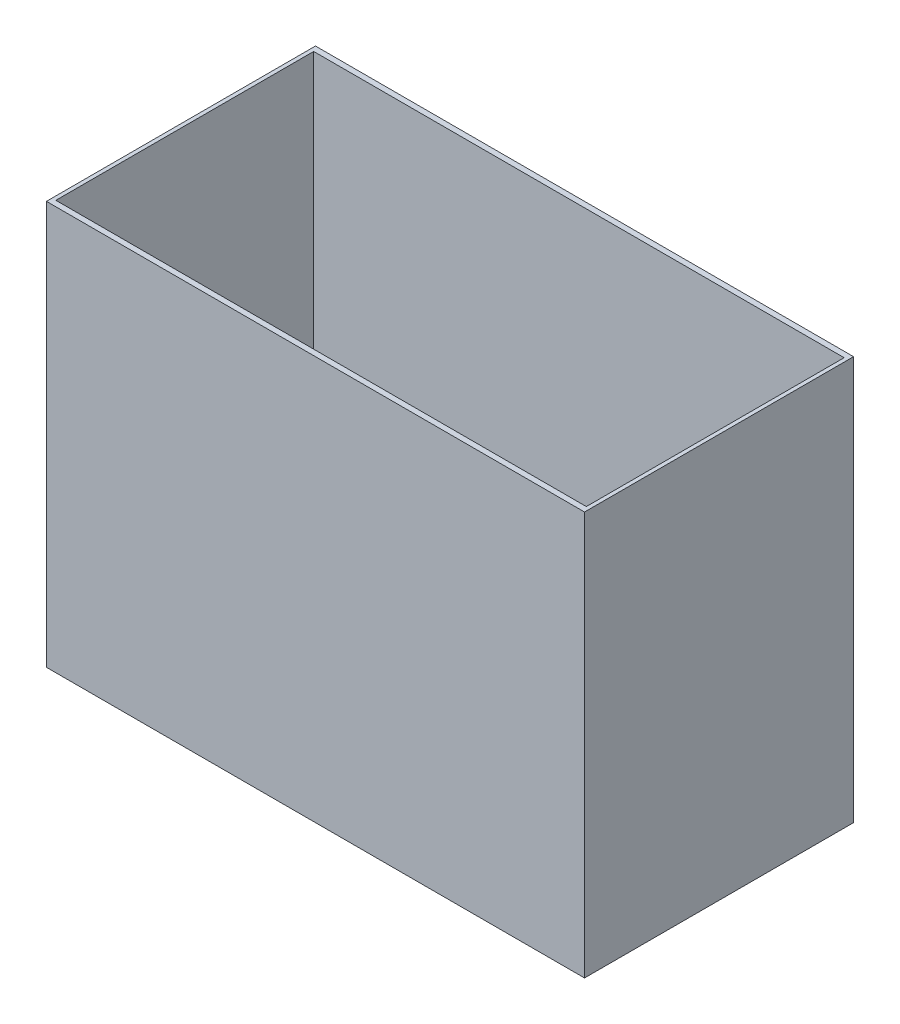
ISO-10303-21;
HEADER;
FILE_DESCRIPTION(('STEP AP214'),'2;1');
FILE_NAME('part.step','',(''),(''),'','','');
FILE_SCHEMA(('AUTOMOTIVE_DESIGN { 1 0 10303 214 1 1 1 1 }'));
ENDSEC;
DATA;
#1=APPLICATION_CONTEXT('core data for automotive mechanical design processes');
#2=APPLICATION_PROTOCOL_DEFINITION('international standard','automotive_design',2000,#1);
#3=PRODUCT_CONTEXT('',#1,'mechanical');
#4=PRODUCT('Part','Part','',(#3));
#5=PRODUCT_RELATED_PRODUCT_CATEGORY('part','',(#4));
#6=PRODUCT_DEFINITION_FORMATION('','',#4);
#7=PRODUCT_DEFINITION_CONTEXT('part definition',#1,'design');
#8=PRODUCT_DEFINITION('design','',#6,#7);
#9=PRODUCT_DEFINITION_SHAPE('','',#8);
#10=(LENGTH_UNIT() NAMED_UNIT(*) SI_UNIT(.MILLI.,.METRE.));
#11=(NAMED_UNIT(*) PLANE_ANGLE_UNIT() SI_UNIT($,.RADIAN.));
#12=(NAMED_UNIT(*) SI_UNIT($,.STERADIAN.) SOLID_ANGLE_UNIT());
#13=UNCERTAINTY_MEASURE_WITH_UNIT(LENGTH_MEASURE(1.E-05),#10,'distance_accuracy_value','');
#14=(GEOMETRIC_REPRESENTATION_CONTEXT(3) GLOBAL_UNCERTAINTY_ASSIGNED_CONTEXT((#13)) GLOBAL_UNIT_ASSIGNED_CONTEXT((#10,
#11,#12)) REPRESENTATION_CONTEXT('',''));
#15=CARTESIAN_POINT('',(0.,0.,0.));
#16=DIRECTION('',(0.,0.,1.));
#17=DIRECTION('',(1.,0.,0.));
#18=AXIS2_PLACEMENT_3D('',#15,#16,#17);
#19=CARTESIAN_POINT('',(0.,457.2,0.));
#20=DIRECTION('',(0.,-1.,0.));
#21=DIRECTION('',(0.,0.,-1.));
#22=AXIS2_PLACEMENT_3D('',#19,#20,#21);
#23=PLANE('',#22);
#24=DIRECTION('',(0.,0.,-1.));
#25=VECTOR('',#24,1.);
#26=CARTESIAN_POINT('',(304.8,457.2,152.4));
#27=LINE('',#26,#25);
#28=CARTESIAN_POINT('',(304.8,457.2,152.4));
#29=VERTEX_POINT('',#28);
#30=CARTESIAN_POINT('',(304.8,457.2,-152.4));
#31=VERTEX_POINT('',#30);
#32=EDGE_CURVE('E151',#29,#31,#27,.T.);
#33=ORIENTED_EDGE('',*,*,#32,.T.);
#34=DIRECTION('',(-1.,0.,0.));
#35=VECTOR('',#34,1.);
#36=CARTESIAN_POINT('',(-304.8,457.2,-152.4));
#37=LINE('',#36,#35);
#38=CARTESIAN_POINT('',(-304.8,457.2,-152.4));
#39=VERTEX_POINT('',#38);
#40=EDGE_CURVE('E154',#31,#39,#37,.T.);
#41=ORIENTED_EDGE('',*,*,#40,.T.);
#42=DIRECTION('',(0.,0.,1.));
#43=VECTOR('',#42,1.);
#44=CARTESIAN_POINT('',(-304.8,457.2,152.4));
#45=LINE('',#44,#43);
#46=CARTESIAN_POINT('',(-304.8,457.2,152.4));
#47=VERTEX_POINT('',#46);
#48=EDGE_CURVE('E157',#39,#47,#45,.T.);
#49=ORIENTED_EDGE('',*,*,#48,.T.);
#50=DIRECTION('',(1.,0.,0.));
#51=VECTOR('',#50,1.);
#52=CARTESIAN_POINT('',(-304.8,457.2,152.4));
#53=LINE('',#52,#51);
#54=EDGE_CURVE('E159',#47,#29,#53,.T.);
#55=ORIENTED_EDGE('',*,*,#54,.T.);
#56=EDGE_LOOP('',(#33,#41,#49,#55));
#57=FACE_BOUND('',#56,.T.);
#58=DIRECTION('',(0.,0.,-1.));
#59=VECTOR('',#58,1.);
#60=CARTESIAN_POINT('',(300.482,457.2,146.05));
#61=LINE('',#60,#59);
#62=CARTESIAN_POINT('',(300.482,457.2,146.05));
#63=VERTEX_POINT('',#62);
#64=CARTESIAN_POINT('',(300.482,457.2,-146.05));
#65=VERTEX_POINT('',#64);
#66=EDGE_CURVE('E115',#63,#65,#61,.T.);
#67=ORIENTED_EDGE('',*,*,#66,.F.);
#68=DIRECTION('',(1.,0.,0.));
#69=VECTOR('',#68,1.);
#70=CARTESIAN_POINT('',(-300.482,457.2,146.05));
#71=LINE('',#70,#69);
#72=CARTESIAN_POINT('',(-300.482,457.2,146.05));
#73=VERTEX_POINT('',#72);
#74=EDGE_CURVE('E137',#73,#63,#71,.T.);
#75=ORIENTED_EDGE('',*,*,#74,.F.);
#76=DIRECTION('',(0.,0.,1.));
#77=VECTOR('',#76,1.);
#78=CARTESIAN_POINT('',(-300.482,457.2,146.05));
#79=LINE('',#78,#77);
#80=CARTESIAN_POINT('',(-300.482,457.2,-146.05));
#81=VERTEX_POINT('',#80);
#82=EDGE_CURVE('E135',#81,#73,#79,.T.);
#83=ORIENTED_EDGE('',*,*,#82,.F.);
#84=DIRECTION('',(-1.,0.,0.));
#85=VECTOR('',#84,1.);
#86=CARTESIAN_POINT('',(-300.482,457.2,-146.05));
#87=LINE('',#86,#85);
#88=EDGE_CURVE('E123',#65,#81,#87,.T.);
#89=ORIENTED_EDGE('',*,*,#88,.F.);
#90=EDGE_LOOP('',(#67,#75,#83,#89));
#91=FACE_BOUND('',#90,.T.);
#92=ADVANCED_FACE('F50',(#57,#91),#23,.F.);
#93=CARTESIAN_POINT('',(0.,0.,0.));
#94=DIRECTION('',(0.,-1.,0.));
#95=DIRECTION('',(0.,0.,-1.));
#96=AXIS2_PLACEMENT_3D('',#93,#94,#95);
#97=PLANE('',#96);
#98=DIRECTION('',(0.,0.,-1.));
#99=VECTOR('',#98,1.);
#100=CARTESIAN_POINT('',(304.8,0.,152.4));
#101=LINE('',#100,#99);
#102=CARTESIAN_POINT('',(304.8,0.,152.4));
#103=VERTEX_POINT('',#102);
#104=CARTESIAN_POINT('',(304.8,0.,-152.4));
#105=VERTEX_POINT('',#104);
#106=EDGE_CURVE('E131',#103,#105,#101,.T.);
#107=ORIENTED_EDGE('',*,*,#106,.F.);
#108=DIRECTION('',(1.,0.,0.));
#109=VECTOR('',#108,1.);
#110=CARTESIAN_POINT('',(-304.8,0.,152.4));
#111=LINE('',#110,#109);
#112=CARTESIAN_POINT('',(-304.8,0.,152.4));
#113=VERTEX_POINT('',#112);
#114=EDGE_CURVE('E155',#113,#103,#111,.T.);
#115=ORIENTED_EDGE('',*,*,#114,.F.);
#116=DIRECTION('',(0.,0.,1.));
#117=VECTOR('',#116,1.);
#118=CARTESIAN_POINT('',(-304.8,0.,152.4));
#119=LINE('',#118,#117);
#120=CARTESIAN_POINT('',(-304.8,0.,-152.4));
#121=VERTEX_POINT('',#120);
#122=EDGE_CURVE('E166',#121,#113,#119,.T.);
#123=ORIENTED_EDGE('',*,*,#122,.F.);
#124=DIRECTION('',(-1.,0.,0.));
#125=VECTOR('',#124,1.);
#126=CARTESIAN_POINT('',(-304.8,0.,-152.4));
#127=LINE('',#126,#125);
#128=EDGE_CURVE('E164',#105,#121,#127,.T.);
#129=ORIENTED_EDGE('',*,*,#128,.F.);
#130=EDGE_LOOP('',(#107,#115,#123,#129));
#131=FACE_BOUND('',#130,.T.);
#132=DIRECTION('',(1.,0.,0.));
#133=VECTOR('',#132,1.);
#134=CARTESIAN_POINT('',(-300.482,0.,146.05));
#135=LINE('',#134,#133);
#136=CARTESIAN_POINT('',(-300.482,0.,146.05));
#137=VERTEX_POINT('',#136);
#138=CARTESIAN_POINT('',(300.482,0.,146.05));
#139=VERTEX_POINT('',#138);
#140=EDGE_CURVE('E124',#137,#139,#135,.T.);
#141=ORIENTED_EDGE('',*,*,#140,.T.);
#142=DIRECTION('',(0.,0.,-1.));
#143=VECTOR('',#142,1.);
#144=CARTESIAN_POINT('',(300.482,0.,146.05));
#145=LINE('',#144,#143);
#146=CARTESIAN_POINT('',(300.482,0.,-146.05));
#147=VERTEX_POINT('',#146);
#148=EDGE_CURVE('E73',#139,#147,#145,.T.);
#149=ORIENTED_EDGE('',*,*,#148,.T.);
#150=DIRECTION('',(-1.,0.,0.));
#151=VECTOR('',#150,1.);
#152=CARTESIAN_POINT('',(-300.482,0.,-146.05));
#153=LINE('',#152,#151);
#154=CARTESIAN_POINT('',(-300.482,0.,-146.05));
#155=VERTEX_POINT('',#154);
#156=EDGE_CURVE('E130',#147,#155,#153,.T.);
#157=ORIENTED_EDGE('',*,*,#156,.T.);
#158=DIRECTION('',(0.,0.,1.));
#159=VECTOR('',#158,1.);
#160=CARTESIAN_POINT('',(-300.482,0.,146.05));
#161=LINE('',#160,#159);
#162=EDGE_CURVE('E143',#155,#137,#161,.T.);
#163=ORIENTED_EDGE('',*,*,#162,.T.);
#164=EDGE_LOOP('',(#141,#149,#157,#163));
#165=FACE_BOUND('',#164,.T.);
#166=ADVANCED_FACE('F184',(#131,#165),#97,.T.);
#167=CARTESIAN_POINT('',(304.8,457.2,152.4));
#168=DIRECTION('',(-1.,0.,0.));
#169=DIRECTION('',(0.,0.,1.));
#170=AXIS2_PLACEMENT_3D('',#167,#168,#169);
#171=PLANE('',#170);
#172=ORIENTED_EDGE('',*,*,#106,.T.);
#173=DIRECTION('',(0.,-1.,0.));
#174=VECTOR('',#173,1.);
#175=CARTESIAN_POINT('',(304.8,457.2,-152.4));
#176=LINE('',#175,#174);
#177=EDGE_CURVE('E12',#31,#105,#176,.T.);
#178=ORIENTED_EDGE('',*,*,#177,.F.);
#179=ORIENTED_EDGE('',*,*,#32,.F.);
#180=DIRECTION('',(0.,-1.,0.));
#181=VECTOR('',#180,1.);
#182=CARTESIAN_POINT('',(304.8,457.2,152.4));
#183=LINE('',#182,#181);
#184=EDGE_CURVE('E161',#29,#103,#183,.T.);
#185=ORIENTED_EDGE('',*,*,#184,.T.);
#186=EDGE_LOOP('',(#172,#178,#179,#185));
#187=FACE_BOUND('',#186,.T.);
#188=ADVANCED_FACE('F52',(#187),#171,.F.);
#189=CARTESIAN_POINT('',(-304.8,457.2,-152.4));
#190=DIRECTION('',(0.,0.,1.));
#191=DIRECTION('',(1.,0.,0.));
#192=AXIS2_PLACEMENT_3D('',#189,#190,#191);
#193=PLANE('',#192);
#194=ORIENTED_EDGE('',*,*,#128,.T.);
#195=DIRECTION('',(0.,-1.,0.));
#196=VECTOR('',#195,1.);
#197=CARTESIAN_POINT('',(-304.8,457.2,-152.4));
#198=LINE('',#197,#196);
#199=EDGE_CURVE('E58',#39,#121,#198,.T.);
#200=ORIENTED_EDGE('',*,*,#199,.F.);
#201=ORIENTED_EDGE('',*,*,#40,.F.);
#202=ORIENTED_EDGE('',*,*,#177,.T.);
#203=EDGE_LOOP('',(#194,#200,#201,#202));
#204=FACE_BOUND('',#203,.T.);
#205=ADVANCED_FACE('F194',(#204),#193,.F.);
#206=CARTESIAN_POINT('',(-304.8,457.2,152.4));
#207=DIRECTION('',(1.,0.,0.));
#208=DIRECTION('',(0.,0.,-1.));
#209=AXIS2_PLACEMENT_3D('',#206,#207,#208);
#210=PLANE('',#209);
#211=ORIENTED_EDGE('',*,*,#122,.T.);
#212=DIRECTION('',(0.,-1.,0.));
#213=VECTOR('',#212,1.);
#214=CARTESIAN_POINT('',(-304.8,457.2,152.4));
#215=LINE('',#214,#213);
#216=EDGE_CURVE('E171',#47,#113,#215,.T.);
#217=ORIENTED_EDGE('',*,*,#216,.F.);
#218=ORIENTED_EDGE('',*,*,#48,.F.);
#219=ORIENTED_EDGE('',*,*,#199,.T.);
#220=EDGE_LOOP('',(#211,#217,#218,#219));
#221=FACE_BOUND('',#220,.T.);
#222=ADVANCED_FACE('F178',(#221),#210,.F.);
#223=CARTESIAN_POINT('',(-304.8,457.2,152.4));
#224=DIRECTION('',(0.,0.,-1.));
#225=DIRECTION('',(-1.,0.,0.));
#226=AXIS2_PLACEMENT_3D('',#223,#224,#225);
#227=PLANE('',#226);
#228=ORIENTED_EDGE('',*,*,#114,.T.);
#229=ORIENTED_EDGE('',*,*,#184,.F.);
#230=ORIENTED_EDGE('',*,*,#54,.F.);
#231=ORIENTED_EDGE('',*,*,#216,.T.);
#232=EDGE_LOOP('',(#228,#229,#230,#231));
#233=FACE_BOUND('',#232,.T.);
#234=ADVANCED_FACE('F188',(#233),#227,.F.);
#235=CARTESIAN_POINT('',(300.482,457.2,146.05));
#236=DIRECTION('',(-1.,0.,0.));
#237=DIRECTION('',(0.,0.,1.));
#238=AXIS2_PLACEMENT_3D('',#235,#236,#237);
#239=PLANE('',#238);
#240=ORIENTED_EDGE('',*,*,#148,.F.);
#241=DIRECTION('',(0.,-1.,0.));
#242=VECTOR('',#241,1.);
#243=CARTESIAN_POINT('',(300.482,457.2,146.05));
#244=LINE('',#243,#242);
#245=EDGE_CURVE('E119',#63,#139,#244,.T.);
#246=ORIENTED_EDGE('',*,*,#245,.F.);
#247=ORIENTED_EDGE('',*,*,#66,.T.);
#248=DIRECTION('',(0.,-1.,0.));
#249=VECTOR('',#248,1.);
#250=CARTESIAN_POINT('',(300.482,457.2,-146.05));
#251=LINE('',#250,#249);
#252=EDGE_CURVE('E118',#65,#147,#251,.T.);
#253=ORIENTED_EDGE('',*,*,#252,.T.);
#254=EDGE_LOOP('',(#240,#246,#247,#253));
#255=FACE_BOUND('',#254,.T.);
#256=ADVANCED_FACE('F117',(#255),#239,.T.);
#257=CARTESIAN_POINT('',(-300.482,457.2,-146.05));
#258=DIRECTION('',(0.,0.,1.));
#259=DIRECTION('',(1.,0.,0.));
#260=AXIS2_PLACEMENT_3D('',#257,#258,#259);
#261=PLANE('',#260);
#262=ORIENTED_EDGE('',*,*,#156,.F.);
#263=ORIENTED_EDGE('',*,*,#252,.F.);
#264=ORIENTED_EDGE('',*,*,#88,.T.);
#265=DIRECTION('',(0.,-1.,0.));
#266=VECTOR('',#265,1.);
#267=CARTESIAN_POINT('',(-300.482,457.2,-146.05));
#268=LINE('',#267,#266);
#269=EDGE_CURVE('E132',#81,#155,#268,.T.);
#270=ORIENTED_EDGE('',*,*,#269,.T.);
#271=EDGE_LOOP('',(#262,#263,#264,#270));
#272=FACE_BOUND('',#271,.T.);
#273=ADVANCED_FACE('F127',(#272),#261,.T.);
#274=CARTESIAN_POINT('',(-300.482,457.2,146.05));
#275=DIRECTION('',(1.,0.,0.));
#276=DIRECTION('',(0.,0.,-1.));
#277=AXIS2_PLACEMENT_3D('',#274,#275,#276);
#278=PLANE('',#277);
#279=ORIENTED_EDGE('',*,*,#162,.F.);
#280=ORIENTED_EDGE('',*,*,#269,.F.);
#281=ORIENTED_EDGE('',*,*,#82,.T.);
#282=DIRECTION('',(0.,-1.,0.));
#283=VECTOR('',#282,1.);
#284=CARTESIAN_POINT('',(-300.482,457.2,146.05));
#285=LINE('',#284,#283);
#286=EDGE_CURVE('E65',#73,#137,#285,.T.);
#287=ORIENTED_EDGE('',*,*,#286,.T.);
#288=EDGE_LOOP('',(#279,#280,#281,#287));
#289=FACE_BOUND('',#288,.T.);
#290=ADVANCED_FACE('F217',(#289),#278,.T.);
#291=CARTESIAN_POINT('',(-300.482,457.2,146.05));
#292=DIRECTION('',(0.,0.,-1.));
#293=DIRECTION('',(-1.,0.,0.));
#294=AXIS2_PLACEMENT_3D('',#291,#292,#293);
#295=PLANE('',#294);
#296=ORIENTED_EDGE('',*,*,#140,.F.);
#297=ORIENTED_EDGE('',*,*,#286,.F.);
#298=ORIENTED_EDGE('',*,*,#74,.T.);
#299=ORIENTED_EDGE('',*,*,#245,.T.);
#300=EDGE_LOOP('',(#296,#297,#298,#299));
#301=FACE_BOUND('',#300,.T.);
#302=ADVANCED_FACE('F221',(#301),#295,.T.);
#303=CLOSED_SHELL('',(#92,#166,#188,#205,#222,#234,#256,#273,#290,#302));
#304=MANIFOLD_SOLID_BREP('B2_NOT_SHOWN',#303);
#305=CARTESIAN_POINT('',(254.,0.,101.6));
#306=DIRECTION('',(0.,1.,0.));
#307=DIRECTION('',(0.,0.,1.));
#308=AXIS2_PLACEMENT_3D('',#305,#306,#307);
#309=CYLINDRICAL_SURFACE('',#308,2.77812500000002);
#310=CARTESIAN_POINT('',(254.,12.7,101.6));
#311=DIRECTION('',(0.,-1.,0.));
#312=DIRECTION('',(0.,0.,-1.));
#313=AXIS2_PLACEMENT_3D('',#310,#311,#312);
#314=CIRCLE('',#313,2.77812500000002);
#315=CARTESIAN_POINT('',(254.,12.7,98.821875));
#316=VERTEX_POINT('',#315);
#317=EDGE_CURVE('E368',#316,#316,#314,.T.);
#318=ORIENTED_EDGE('',*,*,#317,.F.);
#319=EDGE_LOOP('',(#318));
#320=FACE_BOUND('',#319,.T.);
#321=CARTESIAN_POINT('',(254.,2.54,101.6));
#322=DIRECTION('',(0.,-1.,0.));
#323=DIRECTION('',(0.,0.,-1.));
#324=AXIS2_PLACEMENT_3D('',#321,#322,#323);
#325=CIRCLE('',#324,2.77812500000002);
#326=CARTESIAN_POINT('',(254.,2.54,98.821875));
#327=VERTEX_POINT('',#326);
#328=EDGE_CURVE('E284',#327,#327,#325,.T.);
#329=ORIENTED_EDGE('',*,*,#328,.T.);
#330=EDGE_LOOP('',(#329));
#331=FACE_BOUND('',#330,.T.);
#332=ADVANCED_FACE('F280',(#320,#331),#309,.F.);
#333=CARTESIAN_POINT('',(254.,0.,-101.6));
#334=DIRECTION('',(0.,1.,0.));
#335=DIRECTION('',(0.,0.,1.));
#336=AXIS2_PLACEMENT_3D('',#333,#334,#335);
#337=CYLINDRICAL_SURFACE('',#336,2.77812500000002);
#338=CARTESIAN_POINT('',(254.,12.7,-101.6));
#339=DIRECTION('',(0.,1.,0.));
#340=DIRECTION('',(0.,0.,1.));
#341=AXIS2_PLACEMENT_3D('',#338,#339,#340);
#342=CIRCLE('',#341,2.77812500000002);
#343=CARTESIAN_POINT('',(254.,12.7,-98.821875));
#344=VERTEX_POINT('',#343);
#345=EDGE_CURVE('E350',#344,#344,#342,.T.);
#346=ORIENTED_EDGE('',*,*,#345,.T.);
#347=EDGE_LOOP('',(#346));
#348=FACE_BOUND('',#347,.T.);
#349=CARTESIAN_POINT('',(254.,2.54,-101.6));
#350=DIRECTION('',(0.,-1.,0.));
#351=DIRECTION('',(0.,0.,-1.));
#352=AXIS2_PLACEMENT_3D('',#349,#350,#351);
#353=CIRCLE('',#352,2.77812500000002);
#354=CARTESIAN_POINT('',(254.,2.54,-104.378125));
#355=VERTEX_POINT('',#354);
#356=EDGE_CURVE('E355',#355,#355,#353,.F.);
#357=ORIENTED_EDGE('',*,*,#356,.F.);
#358=EDGE_LOOP('',(#357));
#359=FACE_BOUND('',#358,.T.);
#360=ADVANCED_FACE('F404',(#348,#359),#337,.F.);
#361=CARTESIAN_POINT('',(-292.1,12.7,-139.7));
#362=DIRECTION('',(1.,0.,0.));
#363=DIRECTION('',(0.,0.,-1.));
#364=AXIS2_PLACEMENT_3D('',#361,#362,#363);
#365=PLANE('',#364);
#366=DIRECTION('',(0.,0.,1.));
#367=VECTOR('',#366,1.);
#368=CARTESIAN_POINT('',(-292.1,0.,-139.7));
#369=LINE('',#368,#367);
#370=CARTESIAN_POINT('',(-292.1,0.,-139.7));
#371=VERTEX_POINT('',#370);
#372=CARTESIAN_POINT('',(-292.1,0.,139.7));
#373=VERTEX_POINT('',#372);
#374=EDGE_CURVE('E347',#371,#373,#369,.T.);
#375=ORIENTED_EDGE('',*,*,#374,.T.);
#376=DIRECTION('',(0.,-1.,0.));
#377=VECTOR('',#376,1.);
#378=CARTESIAN_POINT('',(-292.1,12.7,139.7));
#379=LINE('',#378,#377);
#380=CARTESIAN_POINT('',(-292.1,12.7,139.7));
#381=VERTEX_POINT('',#380);
#382=EDGE_CURVE('E48',#381,#373,#379,.T.);
#383=ORIENTED_EDGE('',*,*,#382,.F.);
#384=DIRECTION('',(0.,0.,1.));
#385=VECTOR('',#384,1.);
#386=CARTESIAN_POINT('',(-292.1,12.7,-139.7));
#387=LINE('',#386,#385);
#388=CARTESIAN_POINT('',(-292.1,12.7,-139.7));
#389=VERTEX_POINT('',#388);
#390=EDGE_CURVE('E334',#389,#381,#387,.T.);
#391=ORIENTED_EDGE('',*,*,#390,.F.);
#392=DIRECTION('',(0.,-1.,0.));
#393=VECTOR('',#392,1.);
#394=CARTESIAN_POINT('',(-292.1,12.7,-139.7));
#395=LINE('',#394,#393);
#396=EDGE_CURVE('E343',#389,#371,#395,.T.);
#397=ORIENTED_EDGE('',*,*,#396,.T.);
#398=EDGE_LOOP('',(#375,#383,#391,#397));
#399=FACE_BOUND('',#398,.T.);
#400=ADVANCED_FACE('F282',(#399),#365,.F.);
#401=CARTESIAN_POINT('',(-292.1,12.7,139.7));
#402=DIRECTION('',(0.,0.,-1.));
#403=DIRECTION('',(-1.,0.,0.));
#404=AXIS2_PLACEMENT_3D('',#401,#402,#403);
#405=PLANE('',#404);
#406=DIRECTION('',(1.,0.,0.));
#407=VECTOR('',#406,1.);
#408=CARTESIAN_POINT('',(-292.1,0.,139.7));
#409=LINE('',#408,#407);
#410=CARTESIAN_POINT('',(292.1,0.,139.7));
#411=VERTEX_POINT('',#410);
#412=EDGE_CURVE('E338',#373,#411,#409,.T.);
#413=ORIENTED_EDGE('',*,*,#412,.T.);
#414=DIRECTION('',(0.,-1.,0.));
#415=VECTOR('',#414,1.);
#416=CARTESIAN_POINT('',(292.1,12.7,139.7));
#417=LINE('',#416,#415);
#418=CARTESIAN_POINT('',(292.1,12.7,139.7));
#419=VERTEX_POINT('',#418);
#420=EDGE_CURVE('E290',#419,#411,#417,.T.);
#421=ORIENTED_EDGE('',*,*,#420,.F.);
#422=DIRECTION('',(1.,0.,0.));
#423=VECTOR('',#422,1.);
#424=CARTESIAN_POINT('',(-292.1,12.7,139.7));
#425=LINE('',#424,#423);
#426=EDGE_CURVE('E329',#381,#419,#425,.T.);
#427=ORIENTED_EDGE('',*,*,#426,.F.);
#428=ORIENTED_EDGE('',*,*,#382,.T.);
#429=EDGE_LOOP('',(#413,#421,#427,#428));
#430=FACE_BOUND('',#429,.T.);
#431=ADVANCED_FACE('F337',(#430),#405,.F.);
#432=CARTESIAN_POINT('',(292.1,12.7,-139.7));
#433=DIRECTION('',(-1.,0.,0.));
#434=DIRECTION('',(0.,0.,1.));
#435=AXIS2_PLACEMENT_3D('',#432,#433,#434);
#436=PLANE('',#435);
#437=DIRECTION('',(0.,0.,-1.));
#438=VECTOR('',#437,1.);
#439=CARTESIAN_POINT('',(292.1,0.,-139.7));
#440=LINE('',#439,#438);
#441=CARTESIAN_POINT('',(292.1,0.,-139.7));
#442=VERTEX_POINT('',#441);
#443=EDGE_CURVE('E316',#411,#442,#440,.T.);
#444=ORIENTED_EDGE('',*,*,#443,.T.);
#445=DIRECTION('',(0.,-1.,0.));
#446=VECTOR('',#445,1.);
#447=CARTESIAN_POINT('',(292.1,12.7,-139.7));
#448=LINE('',#447,#446);
#449=CARTESIAN_POINT('',(292.1,12.7,-139.7));
#450=VERTEX_POINT('',#449);
#451=EDGE_CURVE('E339',#450,#442,#448,.T.);
#452=ORIENTED_EDGE('',*,*,#451,.F.);
#453=DIRECTION('',(0.,0.,-1.));
#454=VECTOR('',#453,1.);
#455=CARTESIAN_POINT('',(292.1,12.7,-139.7));
#456=LINE('',#455,#454);
#457=EDGE_CURVE('E332',#419,#450,#456,.T.);
#458=ORIENTED_EDGE('',*,*,#457,.F.);
#459=ORIENTED_EDGE('',*,*,#420,.T.);
#460=EDGE_LOOP('',(#444,#452,#458,#459));
#461=FACE_BOUND('',#460,.T.);
#462=ADVANCED_FACE('F341',(#461),#436,.F.);
#463=CARTESIAN_POINT('',(-292.1,12.7,-139.7));
#464=DIRECTION('',(0.,0.,1.));
#465=DIRECTION('',(1.,0.,0.));
#466=AXIS2_PLACEMENT_3D('',#463,#464,#465);
#467=PLANE('',#466);
#468=DIRECTION('',(-1.,0.,0.));
#469=VECTOR('',#468,1.);
#470=CARTESIAN_POINT('',(-292.1,0.,-139.7));
#471=LINE('',#470,#469);
#472=EDGE_CURVE('E322',#442,#371,#471,.T.);
#473=ORIENTED_EDGE('',*,*,#472,.T.);
#474=ORIENTED_EDGE('',*,*,#396,.F.);
#475=DIRECTION('',(-1.,0.,0.));
#476=VECTOR('',#475,1.);
#477=CARTESIAN_POINT('',(-292.1,12.7,-139.7));
#478=LINE('',#477,#476);
#479=EDGE_CURVE('E299',#450,#389,#478,.T.);
#480=ORIENTED_EDGE('',*,*,#479,.F.);
#481=ORIENTED_EDGE('',*,*,#451,.T.);
#482=EDGE_LOOP('',(#473,#474,#480,#481));
#483=FACE_BOUND('',#482,.T.);
#484=ADVANCED_FACE('F398',(#483),#467,.F.);
#485=CARTESIAN_POINT('',(0.,12.7,0.));
#486=DIRECTION('',(0.,1.,0.));
#487=DIRECTION('',(0.,0.,1.));
#488=AXIS2_PLACEMENT_3D('',#485,#486,#487);
#489=PLANE('',#488);
#490=CARTESIAN_POINT('',(190.5,12.7,0.));
#491=DIRECTION('',(0.,1.,0.));
#492=DIRECTION('',(0.,0.,1.));
#493=AXIS2_PLACEMENT_3D('',#490,#491,#492);
#494=CIRCLE('',#493,2.77812499999999);
#495=CARTESIAN_POINT('',(190.5,12.7,2.77812499999999));
#496=VERTEX_POINT('',#495);
#497=EDGE_CURVE('E380',#496,#496,#494,.T.);
#498=ORIENTED_EDGE('',*,*,#497,.F.);
#499=EDGE_LOOP('',(#498));
#500=FACE_BOUND('',#499,.T.);
#501=ORIENTED_EDGE('',*,*,#317,.T.);
#502=EDGE_LOOP('',(#501));
#503=FACE_BOUND('',#502,.T.);
#504=ORIENTED_EDGE('',*,*,#345,.F.);
#505=EDGE_LOOP('',(#504));
#506=FACE_BOUND('',#505,.T.);
#507=ORIENTED_EDGE('',*,*,#390,.T.);
#508=ORIENTED_EDGE('',*,*,#426,.T.);
#509=ORIENTED_EDGE('',*,*,#457,.T.);
#510=ORIENTED_EDGE('',*,*,#479,.T.);
#511=EDGE_LOOP('',(#507,#508,#509,#510));
#512=FACE_BOUND('',#511,.T.);
#513=ADVANCED_FACE('F330',(#500,#503,#506,#512),#489,.T.);
#514=CARTESIAN_POINT('',(0.,0.,0.));
#515=DIRECTION('',(0.,1.,0.));
#516=DIRECTION('',(0.,0.,1.));
#517=AXIS2_PLACEMENT_3D('',#514,#515,#516);
#518=PLANE('',#517);
#519=CARTESIAN_POINT('',(190.5,0.,0.));
#520=DIRECTION('',(0.,1.,0.));
#521=DIRECTION('',(0.,0.,1.));
#522=AXIS2_PLACEMENT_3D('',#519,#520,#521);
#523=CIRCLE('',#522,2.77812499999999);
#524=CARTESIAN_POINT('',(190.5,0.,2.77812499999999));
#525=VERTEX_POINT('',#524);
#526=EDGE_CURVE('E377',#525,#525,#523,.T.);
#527=ORIENTED_EDGE('',*,*,#526,.T.);
#528=EDGE_LOOP('',(#527));
#529=FACE_BOUND('',#528,.T.);
#530=CARTESIAN_POINT('',(254.,0.,101.6));
#531=DIRECTION('',(0.,1.,0.));
#532=DIRECTION('',(0.,0.,1.));
#533=AXIS2_PLACEMENT_3D('',#530,#531,#532);
#534=CIRCLE('',#533,6.34999999999999);
#535=CARTESIAN_POINT('',(254.,0.,107.95));
#536=VERTEX_POINT('',#535);
#537=EDGE_CURVE('E373',#536,#536,#534,.T.);
#538=ORIENTED_EDGE('',*,*,#537,.T.);
#539=EDGE_LOOP('',(#538));
#540=FACE_BOUND('',#539,.T.);
#541=CARTESIAN_POINT('',(254.,0.,-101.6));
#542=DIRECTION('',(0.,-1.,0.));
#543=DIRECTION('',(0.,0.,-1.));
#544=AXIS2_PLACEMENT_3D('',#541,#542,#543);
#545=CIRCLE('',#544,6.34999999999999);
#546=CARTESIAN_POINT('',(254.,0.,-107.95));
#547=VERTEX_POINT('',#546);
#548=EDGE_CURVE('E363',#547,#547,#545,.T.);
#549=ORIENTED_EDGE('',*,*,#548,.F.);
#550=EDGE_LOOP('',(#549));
#551=FACE_BOUND('',#550,.T.);
#552=ORIENTED_EDGE('',*,*,#374,.F.);
#553=ORIENTED_EDGE('',*,*,#472,.F.);
#554=ORIENTED_EDGE('',*,*,#443,.F.);
#555=ORIENTED_EDGE('',*,*,#412,.F.);
#556=EDGE_LOOP('',(#552,#553,#554,#555));
#557=FACE_BOUND('',#556,.T.);
#558=ADVANCED_FACE('F386',(#529,#540,#551,#557),#518,.F.);
#559=CARTESIAN_POINT('',(254.,2.54,-101.6));
#560=DIRECTION('',(0.,-1.,0.));
#561=DIRECTION('',(0.,0.,-1.));
#562=AXIS2_PLACEMENT_3D('',#559,#560,#561);
#563=PLANE('',#562);
#564=CARTESIAN_POINT('',(254.,2.54,-101.6));
#565=DIRECTION('',(0.,-1.,0.));
#566=DIRECTION('',(0.,0.,-1.));
#567=AXIS2_PLACEMENT_3D('',#564,#565,#566);
#568=CIRCLE('',#567,6.34999999999999);
#569=CARTESIAN_POINT('',(254.,2.54,-107.95));
#570=VERTEX_POINT('',#569);
#571=EDGE_CURVE('E357',#570,#570,#568,.T.);
#572=ORIENTED_EDGE('',*,*,#571,.T.);
#573=EDGE_LOOP('',(#572));
#574=FACE_BOUND('',#573,.T.);
#575=ORIENTED_EDGE('',*,*,#356,.T.);
#576=EDGE_LOOP('',(#575));
#577=FACE_BOUND('',#576,.T.);
#578=ADVANCED_FACE('F423',(#574,#577),#563,.T.);
#579=CARTESIAN_POINT('',(254.,2.54,-101.6));
#580=DIRECTION('',(0.,-1.,0.));
#581=DIRECTION('',(0.,0.,-1.));
#582=AXIS2_PLACEMENT_3D('',#579,#580,#581);
#583=CYLINDRICAL_SURFACE('',#582,6.34999999999999);
#584=ORIENTED_EDGE('',*,*,#571,.F.);
#585=EDGE_LOOP('',(#584));
#586=FACE_BOUND('',#585,.T.);
#587=ORIENTED_EDGE('',*,*,#548,.T.);
#588=EDGE_LOOP('',(#587));
#589=FACE_BOUND('',#588,.T.);
#590=ADVANCED_FACE('F418',(#586,#589),#583,.F.);
#591=CARTESIAN_POINT('',(254.,2.54,101.6));
#592=DIRECTION('',(0.,-1.,0.));
#593=DIRECTION('',(0.,0.,-1.));
#594=AXIS2_PLACEMENT_3D('',#591,#592,#593);
#595=CYLINDRICAL_SURFACE('',#594,6.34999999999999);
#596=CARTESIAN_POINT('',(254.,2.54,101.6));
#597=DIRECTION('',(0.,1.,0.));
#598=DIRECTION('',(0.,0.,1.));
#599=AXIS2_PLACEMENT_3D('',#596,#597,#598);
#600=CIRCLE('',#599,6.34999999999999);
#601=CARTESIAN_POINT('',(254.,2.54,107.95));
#602=VERTEX_POINT('',#601);
#603=EDGE_CURVE('E376',#602,#602,#600,.T.);
#604=ORIENTED_EDGE('',*,*,#603,.T.);
#605=EDGE_LOOP('',(#604));
#606=FACE_BOUND('',#605,.T.);
#607=ORIENTED_EDGE('',*,*,#537,.F.);
#608=EDGE_LOOP('',(#607));
#609=FACE_BOUND('',#608,.T.);
#610=ADVANCED_FACE('F474',(#606,#609),#595,.F.);
#611=CARTESIAN_POINT('',(254.,2.54,101.6));
#612=DIRECTION('',(0.,-1.,0.));
#613=DIRECTION('',(0.,0.,1.));
#614=AXIS2_PLACEMENT_3D('',#611,#612,#613);
#615=PLANE('',#614);
#616=ORIENTED_EDGE('',*,*,#328,.F.);
#617=EDGE_LOOP('',(#616));
#618=FACE_BOUND('',#617,.T.);
#619=ORIENTED_EDGE('',*,*,#603,.F.);
#620=EDGE_LOOP('',(#619));
#621=FACE_BOUND('',#620,.T.);
#622=ADVANCED_FACE('F392',(#618,#621),#615,.T.);
#623=CARTESIAN_POINT('',(190.5,0.,0.));
#624=DIRECTION('',(0.,1.,0.));
#625=DIRECTION('',(0.,0.,1.));
#626=AXIS2_PLACEMENT_3D('',#623,#624,#625);
#627=CYLINDRICAL_SURFACE('',#626,2.77812499999999);
#628=ORIENTED_EDGE('',*,*,#526,.F.);
#629=EDGE_LOOP('',(#628));
#630=FACE_BOUND('',#629,.T.);
#631=ORIENTED_EDGE('',*,*,#497,.T.);
#632=EDGE_LOOP('',(#631));
#633=FACE_BOUND('',#632,.T.);
#634=ADVANCED_FACE('F389',(#630,#633),#627,.F.);
#635=CLOSED_SHELL('',(#332,#360,#400,#431,#462,#484,#513,#558,#578,#590,#610,#622,#634));
#636=MANIFOLD_SOLID_BREP('B6',#635);
#637=ADVANCED_BREP_SHAPE_REPRESENTATION('',(#18,#304,#636),#14);
#638=SHAPE_DEFINITION_REPRESENTATION(#9,#637);
ENDSEC;
END-ISO-10303-21;
